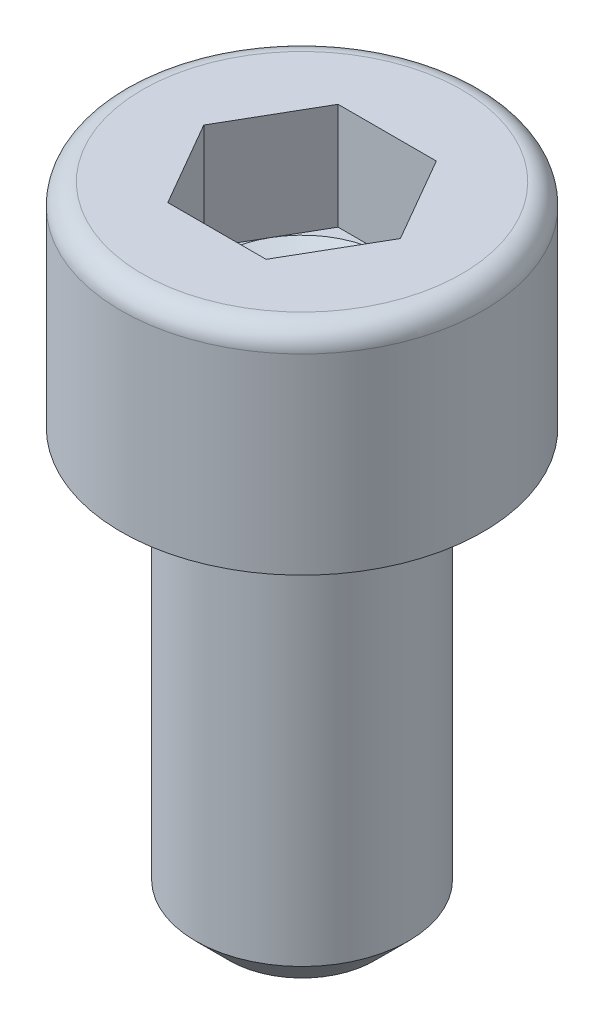
ISO-10303-21;
HEADER;
FILE_DESCRIPTION(('STEP AP214'),'2;1');
FILE_NAME('part.step','',(''),(''),'','','');
FILE_SCHEMA(('AUTOMOTIVE_DESIGN { 1 0 10303 214 1 1 1 1 }'));
ENDSEC;
DATA;
#1=APPLICATION_CONTEXT('core data for automotive mechanical design processes');
#2=APPLICATION_PROTOCOL_DEFINITION('international standard','automotive_design',2000,#1);
#3=PRODUCT_CONTEXT('',#1,'mechanical');
#4=PRODUCT('Part','Part','',(#3));
#5=PRODUCT_RELATED_PRODUCT_CATEGORY('part','',(#4));
#6=PRODUCT_DEFINITION_FORMATION('','',#4);
#7=PRODUCT_DEFINITION_CONTEXT('part definition',#1,'design');
#8=PRODUCT_DEFINITION('design','',#6,#7);
#9=PRODUCT_DEFINITION_SHAPE('','',#8);
#10=(LENGTH_UNIT() NAMED_UNIT(*) SI_UNIT(.MILLI.,.METRE.));
#11=(NAMED_UNIT(*) PLANE_ANGLE_UNIT() SI_UNIT($,.RADIAN.));
#12=(NAMED_UNIT(*) SI_UNIT($,.STERADIAN.) SOLID_ANGLE_UNIT());
#13=UNCERTAINTY_MEASURE_WITH_UNIT(LENGTH_MEASURE(1.E-05),#10,'distance_accuracy_value','');
#14=(GEOMETRIC_REPRESENTATION_CONTEXT(3) GLOBAL_UNCERTAINTY_ASSIGNED_CONTEXT((#13)) GLOBAL_UNIT_ASSIGNED_CONTEXT((#10,
#11,#12)) REPRESENTATION_CONTEXT('',''));
#15=CARTESIAN_POINT('',(0.,0.,0.));
#16=DIRECTION('',(0.,0.,1.));
#17=DIRECTION('',(1.,0.,0.));
#18=AXIS2_PLACEMENT_3D('',#15,#16,#17);
#19=CARTESIAN_POINT('',(2.,5.,0.));
#20=DIRECTION('',(0.,-1.,0.));
#21=DIRECTION('',(1.,0.,0.));
#22=AXIS2_PLACEMENT_3D('',#19,#20,#21);
#23=PLANE('',#22);
#24=CARTESIAN_POINT('',(0.,5.,0.));
#25=DIRECTION('',(0.,1.,0.));
#26=DIRECTION('',(-1.,0.,0.));
#27=AXIS2_PLACEMENT_3D('',#24,#25,#26);
#28=CIRCLE('',#27,3.75);
#29=CARTESIAN_POINT('',(-3.75,5.,0.));
#30=VERTEX_POINT('',#29);
#31=EDGE_CURVE('E150',#30,#30,#28,.T.);
#32=ORIENTED_EDGE('',*,*,#31,.T.);
#33=EDGE_LOOP('',(#32));
#34=FACE_BOUND('',#33,.T.);
#35=DIRECTION('',(0.499999999999998,0.,0.86602540378444));
#36=VECTOR('',#35,1.);
#37=CARTESIAN_POINT('',(1.15470053837925,5.,-2.));
#38=LINE('',#37,#36);
#39=CARTESIAN_POINT('',(1.15470053837925,5.,-2.));
#40=VERTEX_POINT('',#39);
#41=CARTESIAN_POINT('',(2.3094010767585,5.,0.));
#42=VERTEX_POINT('',#41);
#43=EDGE_CURVE('E382',#40,#42,#38,.T.);
#44=ORIENTED_EDGE('',*,*,#43,.T.);
#45=DIRECTION('',(-0.499999999999998,0.,0.86602540378444));
#46=VECTOR('',#45,1.);
#47=CARTESIAN_POINT('',(1.15470053837925,5.,2.));
#48=LINE('',#47,#46);
#49=CARTESIAN_POINT('',(1.15470053837925,5.,2.));
#50=VERTEX_POINT('',#49);
#51=EDGE_CURVE('E385',#42,#50,#48,.T.);
#52=ORIENTED_EDGE('',*,*,#51,.T.);
#53=DIRECTION('',(-1.,0.,0.));
#54=VECTOR('',#53,1.);
#55=CARTESIAN_POINT('',(1.15470053837925,5.,2.));
#56=LINE('',#55,#54);
#57=CARTESIAN_POINT('',(-1.15470053837926,5.,2.));
#58=VERTEX_POINT('',#57);
#59=EDGE_CURVE('E388',#50,#58,#56,.T.);
#60=ORIENTED_EDGE('',*,*,#59,.T.);
#61=DIRECTION('',(-0.499999999999997,0.,-0.86602540378444));
#62=VECTOR('',#61,1.);
#63=CARTESIAN_POINT('',(-1.15470053837926,5.,2.));
#64=LINE('',#63,#62);
#65=CARTESIAN_POINT('',(-2.3094010767585,5.,0.));
#66=VERTEX_POINT('',#65);
#67=EDGE_CURVE('E127',#58,#66,#64,.T.);
#68=ORIENTED_EDGE('',*,*,#67,.T.);
#69=DIRECTION('',(0.499999999999998,0.,-0.86602540378444));
#70=VECTOR('',#69,1.);
#71=CARTESIAN_POINT('',(-1.15470053837925,5.,-2.));
#72=LINE('',#71,#70);
#73=CARTESIAN_POINT('',(-1.15470053837925,5.,-2.));
#74=VERTEX_POINT('',#73);
#75=EDGE_CURVE('E379',#66,#74,#72,.T.);
#76=ORIENTED_EDGE('',*,*,#75,.T.);
#77=DIRECTION('',(1.,0.,0.));
#78=VECTOR('',#77,1.);
#79=CARTESIAN_POINT('',(1.15470053837925,5.,-2.));
#80=LINE('',#79,#78);
#81=EDGE_CURVE('E138',#74,#40,#80,.T.);
#82=ORIENTED_EDGE('',*,*,#81,.T.);
#83=EDGE_LOOP('',(#44,#52,#60,#68,#76,#82));
#84=FACE_BOUND('',#83,.T.);
#85=ADVANCED_FACE('F44',(#34,#84),#23,.F.);
#86=CARTESIAN_POINT('',(0.,-10.,0.));
#87=DIRECTION('',(0.,1.,0.));
#88=DIRECTION('',(0.,0.,1.));
#89=AXIS2_PLACEMENT_3D('',#86,#87,#88);
#90=CYLINDRICAL_SURFACE('',#89,2.5);
#91=CARTESIAN_POINT('',(0.,-9.2,0.));
#92=DIRECTION('',(0.,1.,0.));
#93=DIRECTION('',(0.,0.,1.));
#94=AXIS2_PLACEMENT_3D('',#91,#92,#93);
#95=CIRCLE('',#94,2.5);
#96=CARTESIAN_POINT('',(0.,-9.2,2.5));
#97=VERTEX_POINT('',#96);
#98=EDGE_CURVE('E52',#97,#97,#95,.T.);
#99=ORIENTED_EDGE('',*,*,#98,.T.);
#100=EDGE_LOOP('',(#99));
#101=FACE_BOUND('',#100,.T.);
#102=CARTESIAN_POINT('',(0.,0.,0.));
#103=DIRECTION('',(0.,1.,0.));
#104=DIRECTION('',(0.,0.,1.));
#105=AXIS2_PLACEMENT_3D('',#102,#103,#104);
#106=CIRCLE('',#105,2.5);
#107=CARTESIAN_POINT('',(0.,0.,2.5));
#108=VERTEX_POINT('',#107);
#109=EDGE_CURVE('E160',#108,#108,#106,.T.);
#110=ORIENTED_EDGE('',*,*,#109,.F.);
#111=EDGE_LOOP('',(#110));
#112=FACE_BOUND('',#111,.T.);
#113=ADVANCED_FACE('F165',(#101,#112),#90,.T.);
#114=CARTESIAN_POINT('',(0.,-10.,0.));
#115=DIRECTION('',(0.,1.,0.));
#116=DIRECTION('',(0.,0.,1.));
#117=AXIS2_PLACEMENT_3D('',#114,#115,#116);
#118=PLANE('',#117);
#119=CARTESIAN_POINT('',(0.,-10.,0.));
#120=DIRECTION('',(0.,1.,0.));
#121=DIRECTION('',(0.,0.,1.));
#122=AXIS2_PLACEMENT_3D('',#119,#120,#121);
#123=CIRCLE('',#122,1.7);
#124=CARTESIAN_POINT('',(0.,-10.,1.7));
#125=VERTEX_POINT('',#124);
#126=EDGE_CURVE('E13',#125,#125,#123,.F.);
#127=ORIENTED_EDGE('',*,*,#126,.T.);
#128=EDGE_LOOP('',(#127));
#129=FACE_BOUND('',#128,.T.);
#130=ADVANCED_FACE('F170',(#129),#118,.F.);
#131=CARTESIAN_POINT('',(0.,-9.2,0.));
#132=DIRECTION('',(0.,1.,0.));
#133=DIRECTION('',(0.,0.,1.));
#134=AXIS2_PLACEMENT_3D('',#131,#132,#133);
#135=CONICAL_SURFACE('',#134,2.5,0.785398163397451);
#136=CARTESIAN_POINT('',(0.,-10.,1.7));
#137=CARTESIAN_POINT('',(0.,-9.99166666666667,1.70833333333333));
#138=CARTESIAN_POINT('',(0.,-9.98333333333334,1.71666666666666));
#139=CARTESIAN_POINT('',(0.,-9.96666666666667,1.73333333333333));
#140=CARTESIAN_POINT('',(0.,-9.95833333333333,1.74166666666666));
#141=CARTESIAN_POINT('',(0.,-9.94166666666667,1.75833333333333));
#142=CARTESIAN_POINT('',(0.,-9.93333333333333,1.76666666666666));
#143=CARTESIAN_POINT('',(0.,-9.91666666666667,1.78333333333333));
#144=CARTESIAN_POINT('',(0.,-9.90833333333333,1.79166666666666));
#145=CARTESIAN_POINT('',(0.,-9.89166666666667,1.80833333333333));
#146=CARTESIAN_POINT('',(0.,-9.88333333333333,1.81666666666666));
#147=CARTESIAN_POINT('',(0.,-9.86666666666667,1.83333333333333));
#148=CARTESIAN_POINT('',(0.,-9.85833333333334,1.84166666666666));
#149=CARTESIAN_POINT('',(0.,-9.84166666666667,1.85833333333333));
#150=CARTESIAN_POINT('',(0.,-9.83333333333333,1.86666666666666));
#151=CARTESIAN_POINT('',(0.,-9.81666666666667,1.88333333333333));
#152=CARTESIAN_POINT('',(0.,-9.80833333333333,1.89166666666666));
#153=CARTESIAN_POINT('',(0.,-9.79166666666667,1.90833333333333));
#154=CARTESIAN_POINT('',(0.,-9.78333333333333,1.91666666666666));
#155=CARTESIAN_POINT('',(0.,-9.76666666666667,1.93333333333333));
#156=CARTESIAN_POINT('',(0.,-9.75833333333333,1.94166666666666));
#157=CARTESIAN_POINT('',(0.,-9.74166666666667,1.95833333333333));
#158=CARTESIAN_POINT('',(0.,-9.73333333333333,1.96666666666666));
#159=CARTESIAN_POINT('',(0.,-9.71666666666667,1.98333333333333));
#160=CARTESIAN_POINT('',(0.,-9.70833333333333,1.99166666666666));
#161=CARTESIAN_POINT('',(0.,-9.69166666666667,2.00833333333333));
#162=CARTESIAN_POINT('',(0.,-9.68333333333334,2.01666666666666));
#163=CARTESIAN_POINT('',(0.,-9.66666666666667,2.03333333333333));
#164=CARTESIAN_POINT('',(0.,-9.65833333333333,2.04166666666666));
#165=CARTESIAN_POINT('',(0.,-9.64166666666667,2.05833333333333));
#166=CARTESIAN_POINT('',(0.,-9.63333333333334,2.06666666666666));
#167=CARTESIAN_POINT('',(0.,-9.61666666666667,2.08333333333333));
#168=CARTESIAN_POINT('',(0.,-9.60833333333333,2.09166666666666));
#169=CARTESIAN_POINT('',(0.,-9.59166666666667,2.10833333333333));
#170=CARTESIAN_POINT('',(0.,-9.58333333333333,2.11666666666666));
#171=CARTESIAN_POINT('',(0.,-9.56666666666667,2.13333333333333));
#172=CARTESIAN_POINT('',(0.,-9.55833333333334,2.14166666666666));
#173=CARTESIAN_POINT('',(0.,-9.54166666666667,2.15833333333333));
#174=CARTESIAN_POINT('',(0.,-9.53333333333333,2.16666666666666));
#175=CARTESIAN_POINT('',(0.,-9.51666666666667,2.18333333333333));
#176=CARTESIAN_POINT('',(0.,-9.50833333333334,2.19166666666666));
#177=CARTESIAN_POINT('',(0.,-9.49166666666667,2.20833333333333));
#178=CARTESIAN_POINT('',(0.,-9.48333333333333,2.21666666666667));
#179=CARTESIAN_POINT('',(0.,-9.46666666666667,2.23333333333333));
#180=CARTESIAN_POINT('',(0.,-9.45833333333334,2.24166666666666));
#181=CARTESIAN_POINT('',(0.,-9.44166666666667,2.25833333333333));
#182=CARTESIAN_POINT('',(0.,-9.43333333333334,2.26666666666667));
#183=CARTESIAN_POINT('',(0.,-9.41666666666667,2.28333333333333));
#184=CARTESIAN_POINT('',(0.,-9.40833333333334,2.29166666666667));
#185=CARTESIAN_POINT('',(0.,-9.39166666666667,2.30833333333333));
#186=CARTESIAN_POINT('',(0.,-9.38333333333334,2.31666666666666));
#187=CARTESIAN_POINT('',(0.,-9.36666666666667,2.33333333333333));
#188=CARTESIAN_POINT('',(0.,-9.35833333333333,2.34166666666667));
#189=CARTESIAN_POINT('',(0.,-9.34166666666667,2.35833333333333));
#190=CARTESIAN_POINT('',(0.,-9.33333333333334,2.36666666666667));
#191=CARTESIAN_POINT('',(0.,-9.31666666666667,2.38333333333333));
#192=CARTESIAN_POINT('',(0.,-9.30833333333334,2.39166666666667));
#193=CARTESIAN_POINT('',(0.,-9.29166666666667,2.40833333333333));
#194=CARTESIAN_POINT('',(0.,-9.28333333333334,2.41666666666667));
#195=CARTESIAN_POINT('',(0.,-9.26666666666667,2.43333333333333));
#196=CARTESIAN_POINT('',(0.,-9.25833333333333,2.44166666666667));
#197=CARTESIAN_POINT('',(0.,-9.24166666666667,2.45833333333333));
#198=CARTESIAN_POINT('',(0.,-9.23333333333334,2.46666666666667));
#199=CARTESIAN_POINT('',(0.,-9.21666666666667,2.48333333333333));
#200=CARTESIAN_POINT('',(0.,-9.20833333333333,2.49166666666667));
#201=CARTESIAN_POINT('',(0.,-9.2,2.5));
#202=B_SPLINE_CURVE_WITH_KNOTS('',3,(#136,#137,#138,#139,#140,#141,#142,#143,#144,#145,#146,
#147,#148,#149,#150,#151,#152,#153,#154,#155,#156,#157,#158,#159,#160,#161,#162,#163,#164,#165,
#166,#167,#168,#169,#170,#171,#172,#173,#174,#175,#176,#177,#178,#179,#180,#181,#182,#183,#184,
#185,#186,#187,#188,#189,#190,#191,#192,#193,#194,#195,#196,#197,#198,#199,#200,#201),
.UNSPECIFIED.,.F.,.F.,(4,2,2,2,2,2,2,2,2,2,2,2,2,2,2,2,2,2,2,2,2,2,2,2,2,2,2,2,2,2,2,2,4),(0.,
0.0353553390593269,0.0707106781186546,0.106066017177981,0.141421356237309,0.176776695296636,
0.212132034355964,0.247487373415292,0.282842712474619,0.318198051533947,0.353553390593274,
0.388908729652601,0.424264068711928,0.459619407771256,0.494974746830583,0.530330085889911,
0.565685424949239,0.601040764008565,0.636396103067893,0.67175144212722,0.707106781186548,
0.742462120245875,0.777817459305203,0.813172798364529,0.848528137423857,0.883883476483185,
0.919238815542512,0.95459415460184,0.989949493661167,1.02530483272049,1.06066017177982,
1.09601551083915,1.13137084989848),.UNSPECIFIED.);
#203=EDGE_CURVE('BSEAM46',#125,#97,#202,.T.);
#204=ORIENTED_EDGE('',*,*,#126,.F.);
#205=ORIENTED_EDGE('',*,*,#98,.F.);
#206=ORIENTED_EDGE('',*,*,#203,.T.);
#207=ORIENTED_EDGE('',*,*,#203,.F.);
#208=EDGE_LOOP('',(#204,#206,#205,#207));
#209=FACE_BOUND('',#208,.T.);
#210=ADVANCED_FACE('F46',(#209),#135,.T.);
#211=CARTESIAN_POINT('',(0.,0.,0.));
#212=DIRECTION('',(0.,1.,0.));
#213=DIRECTION('',(-1.,0.,0.));
#214=AXIS2_PLACEMENT_3D('',#211,#212,#213);
#215=PLANE('',#214);
#216=ORIENTED_EDGE('',*,*,#109,.T.);
#217=EDGE_LOOP('',(#216));
#218=FACE_BOUND('',#217,.T.);
#219=CARTESIAN_POINT('',(0.,0.,0.));
#220=DIRECTION('',(0.,1.,0.));
#221=DIRECTION('',(-1.,0.,0.));
#222=AXIS2_PLACEMENT_3D('',#219,#220,#221);
#223=CIRCLE('',#222,4.25);
#224=CARTESIAN_POINT('',(-4.25,0.,0.));
#225=VERTEX_POINT('',#224);
#226=EDGE_CURVE('E157',#225,#225,#223,.T.);
#227=ORIENTED_EDGE('',*,*,#226,.F.);
#228=EDGE_LOOP('',(#227));
#229=FACE_BOUND('',#228,.T.);
#230=ADVANCED_FACE('F169',(#218,#229),#215,.F.);
#231=CARTESIAN_POINT('',(0.,5.,0.));
#232=DIRECTION('',(0.,1.,0.));
#233=DIRECTION('',(-1.,0.,0.));
#234=AXIS2_PLACEMENT_3D('',#231,#232,#233);
#235=CYLINDRICAL_SURFACE('',#234,4.25);
#236=CARTESIAN_POINT('',(0.,4.5,0.));
#237=DIRECTION('',(0.,1.,0.));
#238=DIRECTION('',(-1.,0.,0.));
#239=AXIS2_PLACEMENT_3D('',#236,#237,#238);
#240=CIRCLE('',#239,4.25);
#241=CARTESIAN_POINT('',(-4.25,4.5,0.));
#242=VERTEX_POINT('',#241);
#243=EDGE_CURVE('E154',#242,#242,#240,.T.);
#244=ORIENTED_EDGE('',*,*,#243,.F.);
#245=EDGE_LOOP('',(#244));
#246=FACE_BOUND('',#245,.T.);
#247=ORIENTED_EDGE('',*,*,#226,.T.);
#248=EDGE_LOOP('',(#247));
#249=FACE_BOUND('',#248,.T.);
#250=ADVANCED_FACE('F176',(#246,#249),#235,.T.);
#251=CARTESIAN_POINT('',(0.,4.5,0.));
#252=DIRECTION('',(0.,1.,0.));
#253=DIRECTION('',(-1.,0.,0.));
#254=AXIS2_PLACEMENT_3D('',#251,#252,#253);
#255=TOROIDAL_SURFACE('',#254,3.75,0.5);
#256=ORIENTED_EDGE('',*,*,#31,.F.);
#257=EDGE_LOOP('',(#256));
#258=FACE_BOUND('',#257,.T.);
#259=ORIENTED_EDGE('',*,*,#243,.T.);
#260=EDGE_LOOP('',(#259));
#261=FACE_BOUND('',#260,.T.);
#262=ADVANCED_FACE('F193',(#258,#261),#255,.T.);
#263=CARTESIAN_POINT('',(-1.15470053837925,2.5,-2.));
#264=DIRECTION('',(0.86602540378444,0.,0.499999999999998));
#265=DIRECTION('',(0.499999999999998,0.,-0.86602540378444));
#266=AXIS2_PLACEMENT_3D('',#263,#264,#265);
#267=PLANE('',#266);
#268=ORIENTED_EDGE('',*,*,#75,.F.);
#269=DIRECTION('',(0.,1.,0.));
#270=VECTOR('',#269,1.);
#271=CARTESIAN_POINT('',(-2.3094010767585,2.5,0.));
#272=LINE('',#271,#270);
#273=CARTESIAN_POINT('',(-2.3094010767585,2.5,0.));
#274=VERTEX_POINT('',#273);
#275=EDGE_CURVE('E374',#274,#66,#272,.T.);
#276=ORIENTED_EDGE('',*,*,#275,.F.);
#277=DIRECTION('',(0.499999999999998,0.,-0.86602540378444));
#278=VECTOR('',#277,1.);
#279=CARTESIAN_POINT('',(-1.15470053837925,2.5,-2.));
#280=LINE('',#279,#278);
#281=CARTESIAN_POINT('',(-1.73205080756888,2.5,-0.999999999999996));
#282=VERTEX_POINT('',#281);
#283=EDGE_CURVE('E123',#274,#282,#280,.T.);
#284=ORIENTED_EDGE('',*,*,#283,.T.);
#285=CARTESIAN_POINT('',(-1.15470053837925,2.5,-2.));
#286=VERTEX_POINT('',#285);
#287=EDGE_CURVE('E117',#282,#286,#280,.T.);
#288=ORIENTED_EDGE('',*,*,#287,.T.);
#289=DIRECTION('',(0.,1.,0.));
#290=VECTOR('',#289,1.);
#291=CARTESIAN_POINT('',(-1.15470053837925,2.5,-2.));
#292=LINE('',#291,#290);
#293=EDGE_CURVE('E119',#286,#74,#292,.T.);
#294=ORIENTED_EDGE('',*,*,#293,.T.);
#295=EDGE_LOOP('',(#268,#276,#284,#288,#294));
#296=FACE_BOUND('',#295,.T.);
#297=ADVANCED_FACE('F118',(#296),#267,.T.);
#298=CARTESIAN_POINT('',(1.15470053837926,2.5,-2.));
#299=DIRECTION('',(0.,0.,1.));
#300=DIRECTION('',(1.,0.,0.));
#301=AXIS2_PLACEMENT_3D('',#298,#299,#300);
#302=PLANE('',#301);
#303=ORIENTED_EDGE('',*,*,#81,.F.);
#304=ORIENTED_EDGE('',*,*,#293,.F.);
#305=DIRECTION('',(1.,0.,0.));
#306=VECTOR('',#305,1.);
#307=CARTESIAN_POINT('',(1.15470053837926,2.5,-2.));
#308=LINE('',#307,#306);
#309=CARTESIAN_POINT('',(0.,2.5,-2.));
#310=VERTEX_POINT('',#309);
#311=EDGE_CURVE('E59',#286,#310,#308,.T.);
#312=ORIENTED_EDGE('',*,*,#311,.T.);
#313=CARTESIAN_POINT('',(1.15470053837926,2.5,-2.));
#314=VERTEX_POINT('',#313);
#315=EDGE_CURVE('E133',#310,#314,#308,.T.);
#316=ORIENTED_EDGE('',*,*,#315,.T.);
#317=DIRECTION('',(0.,1.,0.));
#318=VECTOR('',#317,1.);
#319=CARTESIAN_POINT('',(1.15470053837926,2.5,-2.));
#320=LINE('',#319,#318);
#321=EDGE_CURVE('E140',#314,#40,#320,.T.);
#322=ORIENTED_EDGE('',*,*,#321,.T.);
#323=EDGE_LOOP('',(#303,#304,#312,#316,#322));
#324=FACE_BOUND('',#323,.T.);
#325=ADVANCED_FACE('F135',(#324),#302,.T.);
#326=CARTESIAN_POINT('',(1.15470053837926,2.5,-2.));
#327=DIRECTION('',(-0.86602540378444,0.,0.499999999999998));
#328=DIRECTION('',(0.499999999999998,0.,0.86602540378444));
#329=AXIS2_PLACEMENT_3D('',#326,#327,#328);
#330=PLANE('',#329);
#331=ORIENTED_EDGE('',*,*,#43,.F.);
#332=ORIENTED_EDGE('',*,*,#321,.F.);
#333=DIRECTION('',(0.499999999999998,0.,0.86602540378444));
#334=VECTOR('',#333,1.);
#335=CARTESIAN_POINT('',(1.15470053837926,2.5,-2.));
#336=LINE('',#335,#334);
#337=CARTESIAN_POINT('',(1.73205080756888,2.5,-0.999999999999996));
#338=VERTEX_POINT('',#337);
#339=EDGE_CURVE('E407',#314,#338,#336,.T.);
#340=ORIENTED_EDGE('',*,*,#339,.T.);
#341=CARTESIAN_POINT('',(2.3094010767585,2.5,0.));
#342=VERTEX_POINT('',#341);
#343=EDGE_CURVE('E132',#338,#342,#336,.T.);
#344=ORIENTED_EDGE('',*,*,#343,.T.);
#345=DIRECTION('',(0.,1.,0.));
#346=VECTOR('',#345,1.);
#347=CARTESIAN_POINT('',(2.3094010767585,2.5,0.));
#348=LINE('',#347,#346);
#349=EDGE_CURVE('E145',#342,#42,#348,.T.);
#350=ORIENTED_EDGE('',*,*,#349,.T.);
#351=EDGE_LOOP('',(#331,#332,#340,#344,#350));
#352=FACE_BOUND('',#351,.T.);
#353=ADVANCED_FACE('F223',(#352),#330,.T.);
#354=CARTESIAN_POINT('',(1.15470053837925,2.5,2.));
#355=DIRECTION('',(-0.86602540378444,0.,-0.499999999999998));
#356=DIRECTION('',(-0.499999999999998,0.,0.86602540378444));
#357=AXIS2_PLACEMENT_3D('',#354,#355,#356);
#358=PLANE('',#357);
#359=ORIENTED_EDGE('',*,*,#51,.F.);
#360=ORIENTED_EDGE('',*,*,#349,.F.);
#361=DIRECTION('',(-0.499999999999998,0.,0.86602540378444));
#362=VECTOR('',#361,1.);
#363=CARTESIAN_POINT('',(1.15470053837925,2.5,2.));
#364=LINE('',#363,#362);
#365=CARTESIAN_POINT('',(1.73205080756888,2.5,0.999999999999995));
#366=VERTEX_POINT('',#365);
#367=EDGE_CURVE('E405',#342,#366,#364,.T.);
#368=ORIENTED_EDGE('',*,*,#367,.T.);
#369=CARTESIAN_POINT('',(1.15470053837925,2.5,2.));
#370=VERTEX_POINT('',#369);
#371=EDGE_CURVE('E406',#366,#370,#364,.T.);
#372=ORIENTED_EDGE('',*,*,#371,.T.);
#373=DIRECTION('',(0.,1.,0.));
#374=VECTOR('',#373,1.);
#375=CARTESIAN_POINT('',(1.15470053837925,2.5,2.));
#376=LINE('',#375,#374);
#377=EDGE_CURVE('E394',#370,#50,#376,.T.);
#378=ORIENTED_EDGE('',*,*,#377,.T.);
#379=EDGE_LOOP('',(#359,#360,#368,#372,#378));
#380=FACE_BOUND('',#379,.T.);
#381=ADVANCED_FACE('F230',(#380),#358,.T.);
#382=CARTESIAN_POINT('',(1.15470053837925,2.5,2.));
#383=DIRECTION('',(0.,0.,-1.));
#384=DIRECTION('',(-1.,0.,0.));
#385=AXIS2_PLACEMENT_3D('',#382,#383,#384);
#386=PLANE('',#385);
#387=ORIENTED_EDGE('',*,*,#59,.F.);
#388=ORIENTED_EDGE('',*,*,#377,.F.);
#389=DIRECTION('',(-1.,0.,0.));
#390=VECTOR('',#389,1.);
#391=CARTESIAN_POINT('',(1.15470053837925,2.5,2.));
#392=LINE('',#391,#390);
#393=CARTESIAN_POINT('',(0.,2.5,2.));
#394=VERTEX_POINT('',#393);
#395=EDGE_CURVE('E369',#370,#394,#392,.T.);
#396=ORIENTED_EDGE('',*,*,#395,.T.);
#397=CARTESIAN_POINT('',(-1.15470053837926,2.5,2.));
#398=VERTEX_POINT('',#397);
#399=EDGE_CURVE('E365',#394,#398,#392,.T.);
#400=ORIENTED_EDGE('',*,*,#399,.T.);
#401=DIRECTION('',(0.,1.,0.));
#402=VECTOR('',#401,1.);
#403=CARTESIAN_POINT('',(-1.15470053837926,2.5,2.));
#404=LINE('',#403,#402);
#405=EDGE_CURVE('E373',#398,#58,#404,.T.);
#406=ORIENTED_EDGE('',*,*,#405,.T.);
#407=EDGE_LOOP('',(#387,#388,#396,#400,#406));
#408=FACE_BOUND('',#407,.T.);
#409=ADVANCED_FACE('F238',(#408),#386,.T.);
#410=CARTESIAN_POINT('',(-1.15470053837926,2.5,2.));
#411=DIRECTION('',(0.86602540378444,0.,-0.499999999999998));
#412=DIRECTION('',(-0.499999999999998,0.,-0.86602540378444));
#413=AXIS2_PLACEMENT_3D('',#410,#411,#412);
#414=PLANE('',#413);
#415=ORIENTED_EDGE('',*,*,#67,.F.);
#416=ORIENTED_EDGE('',*,*,#405,.F.);
#417=DIRECTION('',(-0.499999999999997,0.,-0.86602540378444));
#418=VECTOR('',#417,1.);
#419=CARTESIAN_POINT('',(-1.15470053837926,2.5,2.));
#420=LINE('',#419,#418);
#421=CARTESIAN_POINT('',(-1.73205080756888,2.5,0.999999999999994));
#422=VERTEX_POINT('',#421);
#423=EDGE_CURVE('E364',#398,#422,#420,.T.);
#424=ORIENTED_EDGE('',*,*,#423,.T.);
#425=EDGE_CURVE('E367',#422,#274,#420,.T.);
#426=ORIENTED_EDGE('',*,*,#425,.T.);
#427=ORIENTED_EDGE('',*,*,#275,.T.);
#428=EDGE_LOOP('',(#415,#416,#424,#426,#427));
#429=FACE_BOUND('',#428,.T.);
#430=ADVANCED_FACE('F246',(#429),#414,.T.);
#431=CARTESIAN_POINT('',(-3.46410161513774,2.5,2.));
#432=DIRECTION('',(0.,-1.,0.));
#433=DIRECTION('',(0.,0.,-1.));
#434=AXIS2_PLACEMENT_3D('',#431,#432,#433);
#435=PLANE('',#434);
#436=ORIENTED_EDGE('',*,*,#311,.F.);
#437=ORIENTED_EDGE('',*,*,#287,.F.);
#438=CARTESIAN_POINT('',(0.,2.5,0.));
#439=DIRECTION('',(0.,1.,0.));
#440=DIRECTION('',(-1.,0.,0.));
#441=AXIS2_PLACEMENT_3D('',#438,#439,#440);
#442=CIRCLE('',#441,2.);
#443=EDGE_CURVE('E130',#310,#282,#442,.T.);
#444=ORIENTED_EDGE('',*,*,#443,.F.);
#445=EDGE_LOOP('',(#436,#437,#444));
#446=FACE_BOUND('',#445,.T.);
#447=ADVANCED_FACE('F129',(#446),#435,.F.);
#448=ORIENTED_EDGE('',*,*,#283,.F.);
#449=ORIENTED_EDGE('',*,*,#425,.F.);
#450=EDGE_CURVE('E139',#282,#422,#442,.T.);
#451=ORIENTED_EDGE('',*,*,#450,.F.);
#452=EDGE_LOOP('',(#448,#449,#451));
#453=FACE_BOUND('',#452,.T.);
#454=ADVANCED_FACE('F261',(#453),#435,.F.);
#455=ORIENTED_EDGE('',*,*,#423,.F.);
#456=ORIENTED_EDGE('',*,*,#399,.F.);
#457=EDGE_CURVE('E144',#422,#394,#442,.T.);
#458=ORIENTED_EDGE('',*,*,#457,.F.);
#459=EDGE_LOOP('',(#455,#456,#458));
#460=FACE_BOUND('',#459,.T.);
#461=ADVANCED_FACE('F269',(#460),#435,.F.);
#462=ORIENTED_EDGE('',*,*,#395,.F.);
#463=ORIENTED_EDGE('',*,*,#371,.F.);
#464=EDGE_CURVE('E151',#394,#366,#442,.T.);
#465=ORIENTED_EDGE('',*,*,#464,.F.);
#466=EDGE_LOOP('',(#462,#463,#465));
#467=FACE_BOUND('',#466,.T.);
#468=ADVANCED_FACE('F276',(#467),#435,.F.);
#469=ORIENTED_EDGE('',*,*,#367,.F.);
#470=ORIENTED_EDGE('',*,*,#343,.F.);
#471=EDGE_CURVE('E411',#366,#338,#442,.T.);
#472=ORIENTED_EDGE('',*,*,#471,.F.);
#473=EDGE_LOOP('',(#469,#470,#472));
#474=FACE_BOUND('',#473,.T.);
#475=ADVANCED_FACE('F283',(#474),#435,.F.);
#476=ORIENTED_EDGE('',*,*,#339,.F.);
#477=ORIENTED_EDGE('',*,*,#315,.F.);
#478=EDGE_CURVE('E410',#338,#310,#442,.T.);
#479=ORIENTED_EDGE('',*,*,#478,.F.);
#480=EDGE_LOOP('',(#476,#477,#479));
#481=FACE_BOUND('',#480,.T.);
#482=ADVANCED_FACE('F263',(#481),#435,.F.);
#483=CARTESIAN_POINT('',(0.,2.5,0.));
#484=DIRECTION('',(0.,1.,0.));
#485=DIRECTION('',(-1.,0.,0.));
#486=AXIS2_PLACEMENT_3D('',#483,#484,#485);
#487=CONICAL_SURFACE('',#486,2.,1.04719755119659);
#488=CARTESIAN_POINT('',(0.,1.34529946162074,0.));
#489=VERTEX_POINT('',#488);
#490=VERTEX_LOOP('',#489);
#491=FACE_BOUND('',#490,.T.);
#492=ORIENTED_EDGE('',*,*,#457,.T.);
#493=ORIENTED_EDGE('',*,*,#464,.T.);
#494=ORIENTED_EDGE('',*,*,#471,.T.);
#495=ORIENTED_EDGE('',*,*,#478,.T.);
#496=ORIENTED_EDGE('',*,*,#443,.T.);
#497=ORIENTED_EDGE('',*,*,#450,.T.);
#498=EDGE_LOOP('',(#492,#493,#494,#495,#496,#497));
#499=FACE_BOUND('',#498,.T.);
#500=ADVANCED_FACE('F191',(#491,#499),#487,.F.);
#501=CLOSED_SHELL('',(#85,#113,#130,#210,#230,#250,#262,#297,#325,#353,#381,#409,#430,#447,#454,
#461,#468,#475,#482,#500));
#502=MANIFOLD_SOLID_BREP('B2',#501);
#503=ADVANCED_BREP_SHAPE_REPRESENTATION('',(#18,#502),#14);
#504=SHAPE_DEFINITION_REPRESENTATION(#9,#503);
ENDSEC;
END-ISO-10303-21;
